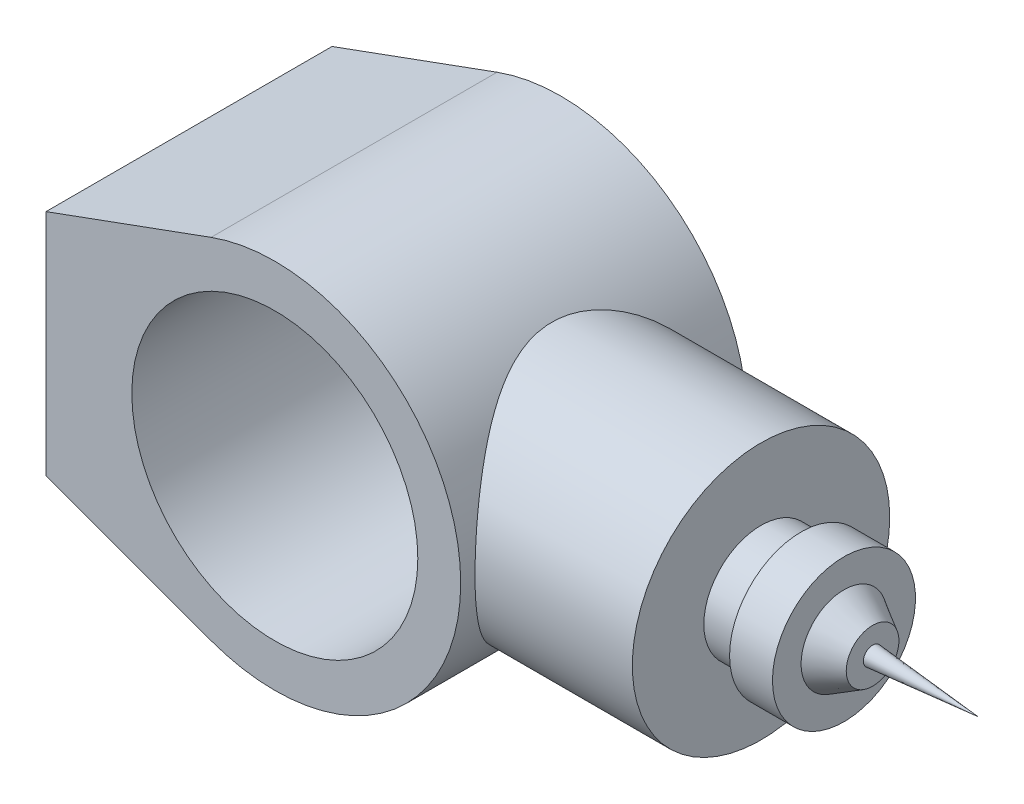
ISO-10303-21;
HEADER;
FILE_DESCRIPTION(('STEP AP214'),'2;1');
FILE_NAME('part.step','',(''),(''),'','','');
FILE_SCHEMA(('AUTOMOTIVE_DESIGN { 1 0 10303 214 1 1 1 1 }'));
ENDSEC;
DATA;
#1=APPLICATION_CONTEXT('core data for automotive mechanical design processes');
#2=APPLICATION_PROTOCOL_DEFINITION('international standard','automotive_design',2000,#1);
#3=PRODUCT_CONTEXT('',#1,'mechanical');
#4=PRODUCT('Part','Part','',(#3));
#5=PRODUCT_RELATED_PRODUCT_CATEGORY('part','',(#4));
#6=PRODUCT_DEFINITION_FORMATION('','',#4);
#7=PRODUCT_DEFINITION_CONTEXT('part definition',#1,'design');
#8=PRODUCT_DEFINITION('design','',#6,#7);
#9=PRODUCT_DEFINITION_SHAPE('','',#8);
#10=(LENGTH_UNIT() NAMED_UNIT(*) SI_UNIT(.MILLI.,.METRE.));
#11=(NAMED_UNIT(*) PLANE_ANGLE_UNIT() SI_UNIT($,.RADIAN.));
#12=(NAMED_UNIT(*) SI_UNIT($,.STERADIAN.) SOLID_ANGLE_UNIT());
#13=UNCERTAINTY_MEASURE_WITH_UNIT(LENGTH_MEASURE(1.E-05),#10,'distance_accuracy_value','');
#14=(GEOMETRIC_REPRESENTATION_CONTEXT(3) GLOBAL_UNCERTAINTY_ASSIGNED_CONTEXT((#13)) GLOBAL_UNIT_ASSIGNED_CONTEXT((#10,
#11,#12)) REPRESENTATION_CONTEXT('',''));
#15=CARTESIAN_POINT('',(0.,0.,0.));
#16=DIRECTION('',(0.,0.,1.));
#17=DIRECTION('',(1.,0.,0.));
#18=AXIS2_PLACEMENT_3D('',#15,#16,#17);
#19=CARTESIAN_POINT('',(0.,0.,50.));
#20=DIRECTION('',(0.,0.,1.));
#21=DIRECTION('',(1.,0.,0.));
#22=AXIS2_PLACEMENT_3D('',#19,#20,#21);
#23=PLANE('',#22);
#24=DIRECTION('',(-0.939410286372225,-0.342794856813887,0.));
#25=VECTOR('',#24,1.);
#26=CARTESIAN_POINT('',(-80.,40.,50.));
#27=LINE('',#26,#25);
#28=CARTESIAN_POINT('',(-22.2816656929027,61.0616686141947,50.));
#29=VERTEX_POINT('',#28);
#30=CARTESIAN_POINT('',(-80.,40.,50.));
#31=VERTEX_POINT('',#30);
#32=EDGE_CURVE('E183',#29,#31,#27,.T.);
#33=ORIENTED_EDGE('',*,*,#32,.T.);
#34=DIRECTION('',(0.,-1.,0.));
#35=VECTOR('',#34,1.);
#36=CARTESIAN_POINT('',(-80.,-40.,50.));
#37=LINE('',#36,#35);
#38=CARTESIAN_POINT('',(-80.,-40.,50.));
#39=VERTEX_POINT('',#38);
#40=EDGE_CURVE('E85',#31,#39,#37,.T.);
#41=ORIENTED_EDGE('',*,*,#40,.T.);
#42=DIRECTION('',(0.939410286372225,-0.342794856813887,0.));
#43=VECTOR('',#42,1.);
#44=CARTESIAN_POINT('',(-80.,-40.,50.));
#45=LINE('',#44,#43);
#46=CARTESIAN_POINT('',(-22.2816656929027,-61.0616686141947,50.));
#47=VERTEX_POINT('',#46);
#48=EDGE_CURVE('E179',#39,#47,#45,.T.);
#49=ORIENTED_EDGE('',*,*,#48,.T.);
#50=CARTESIAN_POINT('',(0.,0.,50.));
#51=DIRECTION('',(0.,0.,1.));
#52=DIRECTION('',(1.,0.,0.));
#53=AXIS2_PLACEMENT_3D('',#50,#51,#52);
#54=CIRCLE('',#53,65.);
#55=EDGE_CURVE('E54',#47,#29,#54,.T.);
#56=ORIENTED_EDGE('',*,*,#55,.T.);
#57=EDGE_LOOP('',(#33,#41,#49,#56));
#58=FACE_BOUND('',#57,.T.);
#59=CARTESIAN_POINT('',(0.,0.,50.));
#60=DIRECTION('',(0.,0.,1.));
#61=DIRECTION('',(1.,0.,0.));
#62=AXIS2_PLACEMENT_3D('',#59,#60,#61);
#63=CIRCLE('',#62,50.);
#64=CARTESIAN_POINT('',(50.,0.,50.));
#65=VERTEX_POINT('',#64);
#66=EDGE_CURVE('E193',#65,#65,#63,.T.);
#67=ORIENTED_EDGE('',*,*,#66,.F.);
#68=EDGE_LOOP('',(#67));
#69=FACE_BOUND('',#68,.T.);
#70=ADVANCED_FACE('F37',(#58,#69),#23,.T.);
#71=CARTESIAN_POINT('',(0.,0.,-50.));
#72=DIRECTION('',(0.,0.,1.));
#73=DIRECTION('',(1.,0.,0.));
#74=AXIS2_PLACEMENT_3D('',#71,#72,#73);
#75=PLANE('',#74);
#76=DIRECTION('',(-0.939410286372225,-0.342794856813887,0.));
#77=VECTOR('',#76,1.);
#78=CARTESIAN_POINT('',(-80.,40.,-50.));
#79=LINE('',#78,#77);
#80=CARTESIAN_POINT('',(-22.2816656929027,61.0616686141947,-50.));
#81=VERTEX_POINT('',#80);
#82=CARTESIAN_POINT('',(-80.,40.,-50.));
#83=VERTEX_POINT('',#82);
#84=EDGE_CURVE('E177',#81,#83,#79,.T.);
#85=ORIENTED_EDGE('',*,*,#84,.F.);
#86=CARTESIAN_POINT('',(0.,0.,-50.));
#87=DIRECTION('',(0.,0.,1.));
#88=DIRECTION('',(1.,0.,0.));
#89=AXIS2_PLACEMENT_3D('',#86,#87,#88);
#90=CIRCLE('',#89,65.);
#91=CARTESIAN_POINT('',(-22.2816656929027,-61.0616686141947,-50.));
#92=VERTEX_POINT('',#91);
#93=EDGE_CURVE('E78',#92,#81,#90,.T.);
#94=ORIENTED_EDGE('',*,*,#93,.F.);
#95=DIRECTION('',(0.939410286372225,-0.342794856813887,0.));
#96=VECTOR('',#95,1.);
#97=CARTESIAN_POINT('',(-80.,-40.,-50.));
#98=LINE('',#97,#96);
#99=CARTESIAN_POINT('',(-80.,-40.,-50.));
#100=VERTEX_POINT('',#99);
#101=EDGE_CURVE('E72',#100,#92,#98,.T.);
#102=ORIENTED_EDGE('',*,*,#101,.F.);
#103=DIRECTION('',(0.,-1.,0.));
#104=VECTOR('',#103,1.);
#105=CARTESIAN_POINT('',(-80.,-40.,-50.));
#106=LINE('',#105,#104);
#107=EDGE_CURVE('E172',#83,#100,#106,.T.);
#108=ORIENTED_EDGE('',*,*,#107,.F.);
#109=EDGE_LOOP('',(#85,#94,#102,#108));
#110=FACE_BOUND('',#109,.T.);
#111=CARTESIAN_POINT('',(0.,0.,-50.));
#112=DIRECTION('',(0.,0.,1.));
#113=DIRECTION('',(1.,0.,0.));
#114=AXIS2_PLACEMENT_3D('',#111,#112,#113);
#115=CIRCLE('',#114,50.);
#116=CARTESIAN_POINT('',(50.,0.,-50.));
#117=VERTEX_POINT('',#116);
#118=EDGE_CURVE('E195',#117,#117,#115,.T.);
#119=ORIENTED_EDGE('',*,*,#118,.T.);
#120=EDGE_LOOP('',(#119));
#121=FACE_BOUND('',#120,.T.);
#122=ADVANCED_FACE('F152',(#110,#121),#75,.F.);
#123=CARTESIAN_POINT('',(-80.,40.,50.));
#124=DIRECTION('',(0.342794856813887,-0.939410286372225,0.));
#125=DIRECTION('',(0.939410286372225,0.342794856813887,0.));
#126=AXIS2_PLACEMENT_3D('',#123,#124,#125);
#127=PLANE('',#126);
#128=ORIENTED_EDGE('',*,*,#84,.T.);
#129=DIRECTION('',(0.,0.,-1.));
#130=VECTOR('',#129,1.);
#131=CARTESIAN_POINT('',(-80.,40.,50.));
#132=LINE('',#131,#130);
#133=EDGE_CURVE('E11',#31,#83,#132,.T.);
#134=ORIENTED_EDGE('',*,*,#133,.F.);
#135=ORIENTED_EDGE('',*,*,#32,.F.);
#136=DIRECTION('',(0.,0.,-1.));
#137=VECTOR('',#136,1.);
#138=CARTESIAN_POINT('',(-22.2816656929027,61.0616686141947,50.));
#139=LINE('',#138,#137);
#140=EDGE_CURVE('E187',#29,#81,#139,.T.);
#141=ORIENTED_EDGE('',*,*,#140,.T.);
#142=EDGE_LOOP('',(#128,#134,#135,#141));
#143=FACE_BOUND('',#142,.T.);
#144=ADVANCED_FACE('F39',(#143),#127,.F.);
#145=CARTESIAN_POINT('',(-80.,-40.,50.));
#146=DIRECTION('',(1.,0.,0.));
#147=DIRECTION('',(0.,1.,0.));
#148=AXIS2_PLACEMENT_3D('',#145,#146,#147);
#149=PLANE('',#148);
#150=ORIENTED_EDGE('',*,*,#107,.T.);
#151=DIRECTION('',(0.,0.,-1.));
#152=VECTOR('',#151,1.);
#153=CARTESIAN_POINT('',(-80.,-40.,50.));
#154=LINE('',#153,#152);
#155=EDGE_CURVE('E46',#39,#100,#154,.T.);
#156=ORIENTED_EDGE('',*,*,#155,.F.);
#157=ORIENTED_EDGE('',*,*,#40,.F.);
#158=ORIENTED_EDGE('',*,*,#133,.T.);
#159=EDGE_LOOP('',(#150,#156,#157,#158));
#160=FACE_BOUND('',#159,.T.);
#161=ADVANCED_FACE('F166',(#160),#149,.F.);
#162=CARTESIAN_POINT('',(-80.,-40.,50.));
#163=DIRECTION('',(0.342794856813887,0.939410286372225,0.));
#164=DIRECTION('',(-0.939410286372225,0.342794856813887,0.));
#165=AXIS2_PLACEMENT_3D('',#162,#163,#164);
#166=PLANE('',#165);
#167=ORIENTED_EDGE('',*,*,#101,.T.);
#168=DIRECTION('',(0.,0.,-1.));
#169=VECTOR('',#168,1.);
#170=CARTESIAN_POINT('',(-22.2816656929027,-61.0616686141947,50.));
#171=LINE('',#170,#169);
#172=EDGE_CURVE('E180',#47,#92,#171,.T.);
#173=ORIENTED_EDGE('',*,*,#172,.F.);
#174=ORIENTED_EDGE('',*,*,#48,.F.);
#175=ORIENTED_EDGE('',*,*,#155,.T.);
#176=EDGE_LOOP('',(#167,#173,#174,#175));
#177=FACE_BOUND('',#176,.T.);
#178=ADVANCED_FACE('F163',(#177),#166,.F.);
#179=CARTESIAN_POINT('',(0.,0.,50.));
#180=DIRECTION('',(0.,0.,-1.));
#181=DIRECTION('',(-1.,0.,0.));
#182=AXIS2_PLACEMENT_3D('',#179,#180,#181);
#183=CYLINDRICAL_SURFACE('',#182,65.);
#184=CARTESIAN_POINT('',(65.,0.,-45.));
#185=CARTESIAN_POINT('',(65.0000011696057,1.12147330120565,-45.0000012025283));
#186=CARTESIAN_POINT('',(64.9709159765212,2.24292945230778,-44.9580201602482));
#187=CARTESIAN_POINT('',(64.8553068641383,4.47658414079082,-44.790785609369));
#188=CARTESIAN_POINT('',(64.7687842573088,5.58878288911931,-44.6655340035371));
#189=CARTESIAN_POINT('',(64.5403785763001,7.79555151848628,-44.3336771879691));
#190=CARTESIAN_POINT('',(64.3984760503456,8.89011506447751,-44.1270433931238));
#191=CARTESIAN_POINT('',(64.0626457436966,11.0533096019768,-43.6354760134034));
#192=CARTESIAN_POINT('',(63.8687169569864,12.1219400915896,-43.3505409144375));
#193=CARTESIAN_POINT('',(63.4342222744662,14.2212125160505,-42.7078017297046));
#194=CARTESIAN_POINT('',(63.1938918545645,15.2520162370063,-42.3503651251477));
#195=CARTESIAN_POINT('',(62.6709259446924,17.2756280115286,-41.5659763086892));
#196=CARTESIAN_POINT('',(62.3882907364915,18.268436318107,-41.1390245597888));
#197=CARTESIAN_POINT('',(61.786108553932,20.2116697228795,-40.2199419970838));
#198=CARTESIAN_POINT('',(61.4665619062631,21.1620951960855,-39.7278117601444));
#199=CARTESIAN_POINT('',(60.7962171584065,23.0172309124314,-38.6825647509799));
#200=CARTESIAN_POINT('',(60.4454175300334,23.9219389167185,-38.1294449962195));
#201=CARTESIAN_POINT('',(59.6865648974474,25.7601880140228,-36.9151737617935));
#202=CARTESIAN_POINT('',(59.27618815402,26.6893215363404,-36.2488040005491));
#203=CARTESIAN_POINT('',(58.4330275057249,28.4880338622967,-34.8529502059224));
#204=CARTESIAN_POINT('',(58.0002425478181,29.3576098626539,-34.1234632053608));
#205=CARTESIAN_POINT('',(57.1195111836477,31.0364486388513,-32.6040251352403));
#206=CARTESIAN_POINT('',(56.6715447181891,31.8456267033451,-31.8139921794123));
#207=CARTESIAN_POINT('',(55.7691986061138,33.4006700551814,-30.1773036556993));
#208=CARTESIAN_POINT('',(55.3148185876119,34.1465316534289,-29.3306447936721));
#209=CARTESIAN_POINT('',(54.3303114345595,35.6959084068904,-27.4326466159468));
#210=CARTESIAN_POINT('',(53.8005937511269,36.4872853280241,-26.3711450656527));
#211=CARTESIAN_POINT('',(52.7593327891933,37.9773509509911,-24.17604025639));
#212=CARTESIAN_POINT('',(52.2477941160227,38.6760162868262,-23.0424189272517));
#213=CARTESIAN_POINT('',(51.2608149265043,39.9749077721744,-20.7072341856928));
#214=CARTESIAN_POINT('',(50.7853275075273,40.5752630453964,-19.5057627267967));
#215=CARTESIAN_POINT('',(49.8892399163793,41.6721166930025,-17.036931864064));
#216=CARTESIAN_POINT('',(49.4686114171658,42.1686687478853,-15.7696069409943));
#217=CARTESIAN_POINT('',(48.8208029416879,42.9149535309565,-13.5723996352816));
#218=CARTESIAN_POINT('',(48.5738420263557,43.1936925213245,-12.6581208440976));
#219=CARTESIAN_POINT('',(48.1238801744123,43.6944569649788,-10.8035389223551));
#220=CARTESIAN_POINT('',(47.9208721021929,43.9164916250901,-9.86324004407419));
#221=CARTESIAN_POINT('',(47.5660754926548,44.3005296261305,-7.96250438663409));
#222=CARTESIAN_POINT('',(47.4142038087044,44.4626304606427,-7.00210302149487));
#223=CARTESIAN_POINT('',(47.1671263845177,44.7246555122386,-5.06554052628518));
#224=CARTESIAN_POINT('',(47.0719206259529,44.824579749433,-4.08937940131224));
#225=CARTESIAN_POINT('',(46.9418899090943,44.9607388198673,-2.1232364847967));
#226=CARTESIAN_POINT('',(46.9073939345417,44.9966266570423,-1.13320851844658));
#227=CARTESIAN_POINT('',(46.9013571135476,45.0029190462422,0.847248377093852));
#228=CARTESIAN_POINT('',(46.9298161498631,44.9733237202183,1.837677305534));
#229=CARTESIAN_POINT('',(47.0484302849821,44.8492190899201,3.81128752429081));
#230=CARTESIAN_POINT('',(47.13862305521,44.7546701492421,4.79446401850661));
#231=CARTESIAN_POINT('',(47.3768313176079,44.5024241630868,6.74551496467455));
#232=CARTESIAN_POINT('',(47.5248480621437,44.3447257499009,7.71338908473168));
#233=CARTESIAN_POINT('',(47.8621764271841,43.9803320764262,9.56919366964684));
#234=CARTESIAN_POINT('',(48.0484149088864,43.7772163066585,10.4583970625519));
#235=CARTESIAN_POINT('',(48.4609441046406,43.32010640119,12.2144143492181));
#236=CARTESIAN_POINT('',(48.6872496045115,43.0660934784815,13.0812198417583));
#237=CARTESIAN_POINT('',(49.1738509640383,42.5096331932465,14.7898225666927));
#238=CARTESIAN_POINT('',(49.4341648638834,42.2071601049958,15.6316062329481));
#239=CARTESIAN_POINT('',(49.9825182796335,41.5563350032134,17.2876417419013));
#240=CARTESIAN_POINT('',(50.2705534011697,41.2079902580444,18.1018979206949));
#241=CARTESIAN_POINT('',(51.0225431471345,40.2767822129268,20.1137766396802));
#242=CARTESIAN_POINT('',(51.5007434523328,39.6654891440572,21.2930273345177));
#243=CARTESIAN_POINT('',(52.4891158781477,38.348029920852,23.5833678403921));
#244=CARTESIAN_POINT('',(52.9993005340589,37.6418264436726,24.6944305853524));
#245=CARTESIAN_POINT('',(54.0361557973494,36.1376496350166,26.8476775780095));
#246=CARTESIAN_POINT('',(54.5628535785461,35.3395185623559,27.8897384505711));
#247=CARTESIAN_POINT('',(55.6171804467178,33.6558443419671,29.8998791095632));
#248=CARTESIAN_POINT('',(56.1448094104418,32.7703120184234,30.8679680307498));
#249=CARTESIAN_POINT('',(57.1932449701135,30.9045304086319,32.7363921475659));
#250=CARTESIAN_POINT('',(57.7139191350983,29.9233731295192,33.6358963165067));
#251=CARTESIAN_POINT('',(58.7296419536465,27.8771206485979,35.350355349792));
#252=CARTESIAN_POINT('',(59.2246882700661,26.8120178135979,36.1653025097018));
#253=CARTESIAN_POINT('',(60.1756566955639,24.6035209522421,37.7024332048813));
#254=CARTESIAN_POINT('',(60.6316475651595,23.4602711709794,38.4247809320632));
#255=CARTESIAN_POINT('',(61.4931891608211,21.0989507187335,39.7703323765769));
#256=CARTESIAN_POINT('',(61.898755017873,19.8809026570889,40.3935658507715));
#257=CARTESIAN_POINT('',(62.5646802947783,17.6549035875762,41.4059204565395));
#258=CARTESIAN_POINT('',(62.8372982548467,16.6602403417733,41.8163120535009));
#259=CARTESIAN_POINT('',(63.3397164077328,14.6345031625144,42.5675669112335));
#260=CARTESIAN_POINT('',(63.569522535998,13.603434299959,42.9084398107234));
#261=CARTESIAN_POINT('',(63.9815049902596,11.5110112910016,43.5164676119118));
#262=CARTESIAN_POINT('',(64.1637052650743,10.4496726714621,43.7836595836378));
#263=CARTESIAN_POINT('',(64.476639865795,8.30296993183371,44.2409869387356));
#264=CARTESIAN_POINT('',(64.6073730982257,7.21760530180254,44.431120684921));
#265=CARTESIAN_POINT('',(64.8147345736682,5.02649787175023,44.7321113931983));
#266=CARTESIAN_POINT('',(64.8911534961694,3.92069290489763,44.8426616714377));
#267=CARTESIAN_POINT('',(64.9872183357685,1.70145350776208,44.981563734156));
#268=CARTESIAN_POINT('',(65.0068642771874,0.588019080747696,45.0099155538474));
#269=CARTESIAN_POINT('',(64.9889001241945,-1.63741781931566,44.9839662509349));
#270=CARTESIAN_POINT('',(64.9512898349751,-2.74942028747967,44.929664847113));
#271=CARTESIAN_POINT('',(64.819734418053,-4.96298947367603,44.7392747901952));
#272=CARTESIAN_POINT('',(64.7257910494465,-6.06455651648127,44.6031886909653));
#273=CARTESIAN_POINT('',(64.491175703309,-8.18254449212149,44.2620157992034));
#274=CARTESIAN_POINT('',(64.3536808680178,-9.20007959997774,44.0616107864454));
#275=CARTESIAN_POINT('',(64.0337856060908,-11.2121337136589,43.5930613516679));
#276=CARTESIAN_POINT('',(63.8513873855499,-12.2066538475799,43.3249202574929));
#277=CARTESIAN_POINT('',(63.4451725249075,-14.1673074608523,42.7239854011605));
#278=CARTESIAN_POINT('',(63.2213525684632,-15.1334386601223,42.3911864622047));
#279=CARTESIAN_POINT('',(62.736336352677,-17.0327019487273,41.6643868113868));
#280=CARTESIAN_POINT('',(62.4751380044848,-17.965832190203,41.2703826790343));
#281=CARTESIAN_POINT('',(61.8990085085122,-19.8637431772395,40.3931275129008));
#282=CARTESIAN_POINT('',(61.5815209528501,-20.8256806929253,39.9054081529014));
#283=CARTESIAN_POINT('',(60.9142086391395,-22.7035764997345,38.8677076181211));
#284=CARTESIAN_POINT('',(60.5643826081083,-23.6195329786528,38.3177239921568));
#285=CARTESIAN_POINT('',(59.8381347129401,-25.4032558353403,37.1592008079418));
#286=CARTESIAN_POINT('',(59.4616987975441,-26.270996314329,36.5506302507532));
#287=CARTESIAN_POINT('',(58.6884577670336,-27.9557544991496,35.2787474176625));
#288=CARTESIAN_POINT('',(58.2916515549571,-28.7727694681138,34.6154321925309));
#289=CARTESIAN_POINT('',(57.4151711853793,-30.4889708749912,33.1199200847161));
#290=CARTESIAN_POINT('',(56.9328754552547,-31.3785212006928,32.2781812569548));
#291=CARTESIAN_POINT('',(55.9590893109094,-33.0839042215169,30.5278352445589));
#292=CARTESIAN_POINT('',(55.4675975421249,-33.8997259516808,29.6192181500899));
#293=CARTESIAN_POINT('',(54.4860350387397,-35.45586994741,27.7375714933993));
#294=CARTESIAN_POINT('',(53.9959654596117,-36.1961418986443,26.7644997080007));
#295=CARTESIAN_POINT('',(53.0294834997435,-37.5978502361011,24.7568233036382));
#296=CARTESIAN_POINT('',(52.553069328415,-38.2592969946585,23.7222268074148));
#297=CARTESIAN_POINT('',(51.679941347726,-39.4291013564639,21.7149007388747));
#298=CARTESIAN_POINT('',(51.2803372484816,-39.9463152685162,20.7485884228094));
#299=CARTESIAN_POINT('',(50.5123974548912,-40.9130636661729,18.7705314851885));
#300=CARTESIAN_POINT('',(50.1440619804653,-41.3625976757848,17.7587865441704));
#301=CARTESIAN_POINT('',(49.4504928922364,-42.1893301292689,15.693797265063));
#302=CARTESIAN_POINT('',(49.1251906412473,-42.566644202947,14.6406225749502));
#303=CARTESIAN_POINT('',(48.5290098021012,-43.2451098617227,12.4950157035289));
#304=CARTESIAN_POINT('',(48.2581179989952,-43.5462799449171,11.4025931307277));
#305=CARTESIAN_POINT('',(47.8271610412375,-44.0186874861181,9.3921629994351));
#306=CARTESIAN_POINT('',(47.6558419905218,-44.2036946073207,8.47979353570419));
#307=CARTESIAN_POINT('',(47.3627606953031,-44.517583244497,6.63757582668245));
#308=CARTESIAN_POINT('',(47.2409923142224,-44.6464717105955,5.70772976070373));
#309=CARTESIAN_POINT('',(47.05166615705,-44.8459556683364,3.83718735816971));
#310=CARTESIAN_POINT('',(46.9840561376509,-44.9166073394187,2.89650236820514));
#311=CARTESIAN_POINT('',(46.9055698265682,-44.9985645522097,1.01014116515035));
#312=CARTESIAN_POINT('',(46.894694331428,-45.0098692606967,0.0644648821697862));
#313=CARTESIAN_POINT('',(46.9301408777119,-44.972908524549,-1.82506201386804));
#314=CARTESIAN_POINT('',(46.9764888551696,-44.9246160680299,-2.76891160474201));
#315=CARTESIAN_POINT('',(47.1245232303033,-44.7693052695385,-4.64731891289862));
#316=CARTESIAN_POINT('',(47.226209296244,-44.6622872796082,-5.58187668584874));
#317=CARTESIAN_POINT('',(47.4811423262629,-44.3911660407895,-7.43666598606561));
#318=CARTESIAN_POINT('',(47.634452919394,-44.2269923369625,-8.35687836049678));
#319=CARTESIAN_POINT('',(47.9871889035597,-43.8440109221367,-10.1768310643423));
#320=CARTESIAN_POINT('',(48.1866204648689,-43.6251959006593,-11.0765686368372));
#321=CARTESIAN_POINT('',(48.6908782922366,-43.0625185245671,-13.116726178063));
#322=CARTESIAN_POINT('',(49.0093972350599,-42.7008255731353,-14.2488681052183));
#323=CARTESIAN_POINT('',(49.699554494161,-41.8955268796886,-16.4668795226373));
#324=CARTESIAN_POINT('',(50.0712093704162,-41.4518955887103,-17.5527344499461));
#325=CARTESIAN_POINT('',(50.8544123719762,-40.4872212981013,-19.6760329984318));
#326=CARTESIAN_POINT('',(51.2660067549033,-39.9660881554129,-20.7134183727638));
#327=CARTESIAN_POINT('',(52.116211879306,-38.8508952329155,-22.7363587217865));
#328=CARTESIAN_POINT('',(52.5548209260535,-38.2568400254561,-23.7219169406072));
#329=CARTESIAN_POINT('',(53.4579357785502,-36.9847423381263,-25.6613286822633));
#330=CARTESIAN_POINT('',(53.9228021101371,-36.3051118639051,-26.6139712103077));
#331=CARTESIAN_POINT('',(54.8583333343946,-34.8753950985048,-28.4617532840731));
#332=CARTESIAN_POINT('',(55.3289982185488,-34.1253089107936,-29.3568929142368));
#333=CARTESIAN_POINT('',(56.2664339133503,-32.5564691651912,-31.0876310121466));
#334=CARTESIAN_POINT('',(56.7332035093429,-31.7376950080829,-31.923211478402));
#335=CARTESIAN_POINT('',(57.6535165855435,-30.033481652025,-33.5315189390535));
#336=CARTESIAN_POINT('',(58.1070588196762,-29.1480362003111,-34.3042400240121));
#337=CARTESIAN_POINT('',(59.0635284336244,-27.1643113596245,-35.9022819462667));
#338=CARTESIAN_POINT('',(59.5626106290919,-26.0547472869609,-36.7159606163356));
#339=CARTESIAN_POINT('',(60.5176757229357,-23.7521280348398,-38.2458641369291));
#340=CARTESIAN_POINT('',(60.9736519283074,-22.5590599397198,-38.962073861155));
#341=CARTESIAN_POINT('',(61.6149926579414,-20.7127348127311,-39.9558623322098));
#342=CARTESIAN_POINT('',(61.8215919655179,-20.088110583999,-40.2735888165198));
#343=CARTESIAN_POINT('',(62.2191547005856,-18.8206694867556,-40.8812436548858));
#344=CARTESIAN_POINT('',(62.4101203779565,-18.1778552539997,-41.1711760099034));
#345=CARTESIAN_POINT('',(62.7748527233683,-16.875283117665,-41.7219931318356));
#346=CARTESIAN_POINT('',(62.9486230408552,-16.2155288469421,-41.9828840638124));
#347=CARTESIAN_POINT('',(63.2775356475737,-14.8804011558233,-42.4744610119283));
#348=CARTESIAN_POINT('',(63.432679284421,-14.2050288695917,-42.7051492133046));
#349=CARTESIAN_POINT('',(63.8070721968101,-12.4447010544915,-43.25974494481));
#350=CARTESIAN_POINT('',(64.0114184468014,-11.3490405228654,-43.5602757498286));
#351=CARTESIAN_POINT('',(64.3654191982087,-9.12991345978806,-44.078827644396));
#352=CARTESIAN_POINT('',(64.5150820049425,-8.00645117856259,-44.2968612637911));
#353=CARTESIAN_POINT('',(64.7559993187061,-5.74082253729113,-44.6470112993716));
#354=CARTESIAN_POINT('',(64.847297757104,-4.59867091062173,-44.7791923387443));
#355=CARTESIAN_POINT('',(64.9692976296881,-2.30434018473195,-44.9556862638234));
#356=CARTESIAN_POINT('',(64.9999987983895,-1.15216104160189,-44.999998764566));
#357=CARTESIAN_POINT('',(65.,0.,-45.));
#358=B_SPLINE_CURVE_WITH_KNOTS('',3,(#184,#185,#186,#187,#188,#189,#190,#191,#192,#193,#194,
#195,#196,#197,#198,#199,#200,#201,#202,#203,#204,#205,#206,#207,#208,#209,#210,#211,#212,#213,
#214,#215,#216,#217,#218,#219,#220,#221,#222,#223,#224,#225,#226,#227,#228,#229,#230,#231,#232,
#233,#234,#235,#236,#237,#238,#239,#240,#241,#242,#243,#244,#245,#246,#247,#248,#249,#250,#251,
#252,#253,#254,#255,#256,#257,#258,#259,#260,#261,#262,#263,#264,#265,#266,#267,#268,#269,#270,
#271,#272,#273,#274,#275,#276,#277,#278,#279,#280,#281,#282,#283,#284,#285,#286,#287,#288,#289,
#290,#291,#292,#293,#294,#295,#296,#297,#298,#299,#300,#301,#302,#303,#304,#305,#306,#307,#308,
#309,#310,#311,#312,#313,#314,#315,#316,#317,#318,#319,#320,#321,#322,#323,#324,#325,#326,#327,
#328,#329,#330,#331,#332,#333,#334,#335,#336,#337,#338,#339,#340,#341,#342,#343,#344,#345,#346,
#347,#348,#349,#350,#351,#352,#353,#354,#355,#356,#357),.UNSPECIFIED.,.T.,.F.,(4,2,2,2,2,2,2,2,
2,2,2,2,2,2,2,2,2,2,2,2,2,2,2,2,2,2,2,2,2,2,2,2,2,2,2,2,2,2,2,2,2,2,2,2,2,2,2,2,2,2,2,2,2,2,2,2,
2,2,2,2,2,2,2,2,2,2,2,2,2,2,2,2,2,2,2,2,2,2,2,2,2,2,2,2,2,2,4),(0.,3.36323892794144,
6.72640100710137,10.0907454360665,13.4551549250109,16.8029195613731,20.1506619010729,
23.4983746134034,26.8462511096753,30.4871649037346,34.1282499524345,37.7743494260164,
41.4206611917409,45.6939383064405,49.9682903731881,54.2369825353392,58.5034617073671,
61.4625138492405,64.4210852373372,67.3748225577202,70.3285589227263,73.2982527376573,
76.2679410220407,79.2394430998938,82.2110095388412,85.0011411726389,87.7923045951578,
90.584954683776,93.3771628083065,97.6064034875675,101.837312178738,106.075592113262,
110.313347816192,114.596218662803,118.879479402292,123.155037051935,127.429308626693,
130.755998382163,134.082226580387,137.406778235214,140.731400520075,144.068767009318,
147.406132068879,150.743508483461,154.080780688207,157.215791533369,160.350648386749,
163.485756334407,166.621039552604,169.990545063149,173.360183268584,176.73161428665,
180.103227050672,184.047902440152,187.993163521895,191.94103513809,195.888386692538,
199.385185586645,202.88200907258,206.373186157811,209.863514294626,212.700365177753,
215.536864625513,218.370624567028,221.204424293963,224.039508887241,226.874576485218,
229.713151272815,232.55210603787,236.23803941247,239.925124033801,243.616531168718,
247.307706963636,251.081871120678,254.856029735252,258.631324277359,262.406973327354,
266.792058434818,271.177823293658,273.368885604935,275.55963203795,277.749912517597,
279.940034437727,283.398420446896,286.856280978073,290.31153567335,293.766805506531),.UNSPECIFIED.);
#359=CARTESIAN_POINT('',(65.,0.,-45.));
#360=VERTEX_POINT('',#359);
#361=EDGE_CURVE('E118',#360,#360,#358,.T.);
#362=ORIENTED_EDGE('',*,*,#361,.F.);
#363=EDGE_LOOP('',(#362));
#364=FACE_BOUND('',#363,.T.);
#365=ORIENTED_EDGE('',*,*,#93,.T.);
#366=ORIENTED_EDGE('',*,*,#140,.F.);
#367=ORIENTED_EDGE('',*,*,#55,.F.);
#368=ORIENTED_EDGE('',*,*,#172,.T.);
#369=EDGE_LOOP('',(#365,#366,#367,#368));
#370=FACE_BOUND('',#369,.T.);
#371=ADVANCED_FACE('F149',(#364,#370),#183,.T.);
#372=CARTESIAN_POINT('',(0.,0.,50.));
#373=DIRECTION('',(0.,0.,-1.));
#374=DIRECTION('',(-1.,0.,0.));
#375=AXIS2_PLACEMENT_3D('',#372,#373,#374);
#376=CYLINDRICAL_SURFACE('',#375,50.);
#377=ORIENTED_EDGE('',*,*,#66,.T.);
#378=EDGE_LOOP('',(#377));
#379=FACE_BOUND('',#378,.T.);
#380=ORIENTED_EDGE('',*,*,#118,.F.);
#381=EDGE_LOOP('',(#380));
#382=FACE_BOUND('',#381,.T.);
#383=ADVANCED_FACE('F139',(#379,#382),#376,.F.);
#384=CARTESIAN_POINT('',(-80.002,0.,0.));
#385=DIRECTION('',(1.,0.,0.));
#386=DIRECTION('',(0.,0.,-1.));
#387=AXIS2_PLACEMENT_3D('',#384,#385,#386);
#388=CYLINDRICAL_SURFACE('',#387,45.);
#389=CARTESIAN_POINT('',(120.,0.,0.));
#390=DIRECTION('',(1.,0.,0.));
#391=DIRECTION('',(0.,0.,-1.));
#392=AXIS2_PLACEMENT_3D('',#389,#390,#391);
#393=CIRCLE('',#392,45.);
#394=CARTESIAN_POINT('',(120.,0.,-45.));
#395=VERTEX_POINT('',#394);
#396=EDGE_CURVE('E126',#395,#395,#393,.T.);
#397=ORIENTED_EDGE('',*,*,#396,.F.);
#398=EDGE_LOOP('',(#397));
#399=FACE_BOUND('',#398,.T.);
#400=ORIENTED_EDGE('',*,*,#361,.T.);
#401=EDGE_LOOP('',(#400));
#402=FACE_BOUND('',#401,.T.);
#403=ADVANCED_FACE('F128',(#399,#402),#388,.T.);
#404=CARTESIAN_POINT('',(120.,0.,0.));
#405=DIRECTION('',(1.,0.,0.));
#406=DIRECTION('',(0.,0.,-1.));
#407=AXIS2_PLACEMENT_3D('',#404,#405,#406);
#408=PLANE('',#407);
#409=CARTESIAN_POINT('',(120.,0.,0.));
#410=DIRECTION('',(-1.,0.,0.));
#411=DIRECTION('',(0.,0.,1.));
#412=AXIS2_PLACEMENT_3D('',#409,#410,#411);
#413=CIRCLE('',#412,20.);
#414=CARTESIAN_POINT('',(120.,0.,20.));
#415=VERTEX_POINT('',#414);
#416=EDGE_CURVE('E115',#415,#415,#413,.T.);
#417=ORIENTED_EDGE('',*,*,#416,.T.);
#418=EDGE_LOOP('',(#417));
#419=FACE_BOUND('',#418,.T.);
#420=ORIENTED_EDGE('',*,*,#396,.T.);
#421=EDGE_LOOP('',(#420));
#422=FACE_BOUND('',#421,.T.);
#423=ADVANCED_FACE('F136',(#419,#422),#408,.T.);
#424=CARTESIAN_POINT('',(0.,0.,0.));
#425=DIRECTION('',(-1.,0.,0.));
#426=DIRECTION('',(0.,0.,1.));
#427=AXIS2_PLACEMENT_3D('',#424,#425,#426);
#428=CYLINDRICAL_SURFACE('',#427,20.);
#429=CARTESIAN_POINT('',(134.,0.,0.));
#430=DIRECTION('',(-1.,0.,0.));
#431=DIRECTION('',(0.,0.,1.));
#432=AXIS2_PLACEMENT_3D('',#429,#430,#431);
#433=CIRCLE('',#432,20.);
#434=CARTESIAN_POINT('',(134.,0.,20.));
#435=VERTEX_POINT('',#434);
#436=EDGE_CURVE('E112',#435,#435,#433,.T.);
#437=ORIENTED_EDGE('',*,*,#436,.T.);
#438=EDGE_LOOP('',(#437));
#439=FACE_BOUND('',#438,.T.);
#440=ORIENTED_EDGE('',*,*,#416,.F.);
#441=EDGE_LOOP('',(#440));
#442=FACE_BOUND('',#441,.T.);
#443=ADVANCED_FACE('F134',(#439,#442),#428,.T.);
#444=CARTESIAN_POINT('',(134.,-20.,0.));
#445=DIRECTION('',(-1.,0.,0.));
#446=DIRECTION('',(0.,0.,1.));
#447=AXIS2_PLACEMENT_3D('',#444,#445,#446);
#448=PLANE('',#447);
#449=CARTESIAN_POINT('',(134.,0.,0.));
#450=DIRECTION('',(-1.,0.,0.));
#451=DIRECTION('',(0.,0.,1.));
#452=AXIS2_PLACEMENT_3D('',#449,#450,#451);
#453=CIRCLE('',#452,25.);
#454=CARTESIAN_POINT('',(134.,0.,25.));
#455=VERTEX_POINT('',#454);
#456=EDGE_CURVE('E109',#455,#455,#453,.T.);
#457=ORIENTED_EDGE('',*,*,#456,.T.);
#458=EDGE_LOOP('',(#457));
#459=FACE_BOUND('',#458,.T.);
#460=ORIENTED_EDGE('',*,*,#436,.F.);
#461=EDGE_LOOP('',(#460));
#462=FACE_BOUND('',#461,.T.);
#463=ADVANCED_FACE('F144',(#459,#462),#448,.T.);
#464=CARTESIAN_POINT('',(0.,0.,0.));
#465=DIRECTION('',(-1.,0.,0.));
#466=DIRECTION('',(0.,0.,1.));
#467=AXIS2_PLACEMENT_3D('',#464,#465,#466);
#468=CYLINDRICAL_SURFACE('',#467,25.);
#469=CARTESIAN_POINT('',(149.,0.,0.));
#470=DIRECTION('',(-1.,0.,0.));
#471=DIRECTION('',(0.,0.,1.));
#472=AXIS2_PLACEMENT_3D('',#469,#470,#471);
#473=CIRCLE('',#472,25.);
#474=CARTESIAN_POINT('',(149.,0.,25.));
#475=VERTEX_POINT('',#474);
#476=EDGE_CURVE('E106',#475,#475,#473,.T.);
#477=ORIENTED_EDGE('',*,*,#476,.T.);
#478=EDGE_LOOP('',(#477));
#479=FACE_BOUND('',#478,.T.);
#480=ORIENTED_EDGE('',*,*,#456,.F.);
#481=EDGE_LOOP('',(#480));
#482=FACE_BOUND('',#481,.T.);
#483=ADVANCED_FACE('F245',(#479,#482),#468,.T.);
#484=CARTESIAN_POINT('',(149.,-25.,0.));
#485=DIRECTION('',(1.,0.,0.));
#486=DIRECTION('',(0.,0.,-1.));
#487=AXIS2_PLACEMENT_3D('',#484,#485,#486);
#488=PLANE('',#487);
#489=CARTESIAN_POINT('',(149.,0.,0.));
#490=DIRECTION('',(-1.,0.,0.));
#491=DIRECTION('',(0.,0.,1.));
#492=AXIS2_PLACEMENT_3D('',#489,#490,#491);
#493=CIRCLE('',#492,15.);
#494=CARTESIAN_POINT('',(149.,0.,15.));
#495=VERTEX_POINT('',#494);
#496=EDGE_CURVE('E101',#495,#495,#493,.T.);
#497=ORIENTED_EDGE('',*,*,#496,.T.);
#498=EDGE_LOOP('',(#497));
#499=FACE_BOUND('',#498,.T.);
#500=ORIENTED_EDGE('',*,*,#476,.F.);
#501=EDGE_LOOP('',(#500));
#502=FACE_BOUND('',#501,.T.);
#503=ADVANCED_FACE('F252',(#499,#502),#488,.T.);
#504=CARTESIAN_POINT('',(149.,0.,0.));
#505=DIRECTION('',(-1.,0.,0.));
#506=DIRECTION('',(0.,0.,1.));
#507=AXIS2_PLACEMENT_3D('',#504,#505,#506);
#508=CONICAL_SURFACE('',#507,15.,0.524439823054056);
#509=CARTESIAN_POINT('',(159.,0.,0.));
#510=DIRECTION('',(-1.,0.,0.));
#511=DIRECTION('',(0.,0.,1.));
#512=AXIS2_PLACEMENT_3D('',#509,#510,#511);
#513=CIRCLE('',#512,9.21527789146875);
#514=CARTESIAN_POINT('',(159.,0.,9.21527789146875));
#515=VERTEX_POINT('',#514);
#516=EDGE_CURVE('E98',#515,#515,#513,.T.);
#517=ORIENTED_EDGE('',*,*,#516,.T.);
#518=EDGE_LOOP('',(#517));
#519=FACE_BOUND('',#518,.T.);
#520=ORIENTED_EDGE('',*,*,#496,.F.);
#521=EDGE_LOOP('',(#520));
#522=FACE_BOUND('',#521,.T.);
#523=ADVANCED_FACE('F260',(#519,#522),#508,.T.);
#524=CARTESIAN_POINT('',(159.,-9.21527789146875,0.));
#525=DIRECTION('',(1.,0.,0.));
#526=DIRECTION('',(0.,0.,-1.));
#527=AXIS2_PLACEMENT_3D('',#524,#525,#526);
#528=PLANE('',#527);
#529=CARTESIAN_POINT('',(159.,0.,0.));
#530=DIRECTION('',(-1.,0.,0.));
#531=DIRECTION('',(0.,0.,1.));
#532=AXIS2_PLACEMENT_3D('',#529,#530,#531);
#533=CIRCLE('',#532,3.21527789146875);
#534=CARTESIAN_POINT('',(159.,0.,3.21527789146875));
#535=VERTEX_POINT('',#534);
#536=EDGE_CURVE('E96',#535,#535,#533,.T.);
#537=ORIENTED_EDGE('',*,*,#536,.T.);
#538=EDGE_LOOP('',(#537));
#539=FACE_BOUND('',#538,.T.);
#540=ORIENTED_EDGE('',*,*,#516,.F.);
#541=EDGE_LOOP('',(#540));
#542=FACE_BOUND('',#541,.T.);
#543=ADVANCED_FACE('F92',(#539,#542),#528,.T.);
#544=CARTESIAN_POINT('',(159.,0.,0.));
#545=DIRECTION('',(-1.,0.,0.));
#546=DIRECTION('',(0.,0.,1.));
#547=AXIS2_PLACEMENT_3D('',#544,#545,#546);
#548=CONICAL_SURFACE('',#547,3.21527789146875,0.0870091460395302);
#549=CARTESIAN_POINT('',(195.860032393917,0.,0.));
#550=VERTEX_POINT('',#549);
#551=VERTEX_LOOP('',#550);
#552=FACE_BOUND('',#551,.T.);
#553=ORIENTED_EDGE('',*,*,#536,.F.);
#554=EDGE_LOOP('',(#553));
#555=FACE_BOUND('',#554,.T.);
#556=ADVANCED_FACE('F89',(#552,#555),#548,.T.);
#557=CLOSED_SHELL('',(#70,#122,#144,#161,#178,#371,#383,#403,#423,#443,#463,#483,#503,#523,#543,#556));
#558=MANIFOLD_SOLID_BREP('B2',#557);
#559=ADVANCED_BREP_SHAPE_REPRESENTATION('',(#18,#558),#14);
#560=SHAPE_DEFINITION_REPRESENTATION(#9,#559);
ENDSEC;
END-ISO-10303-21;
